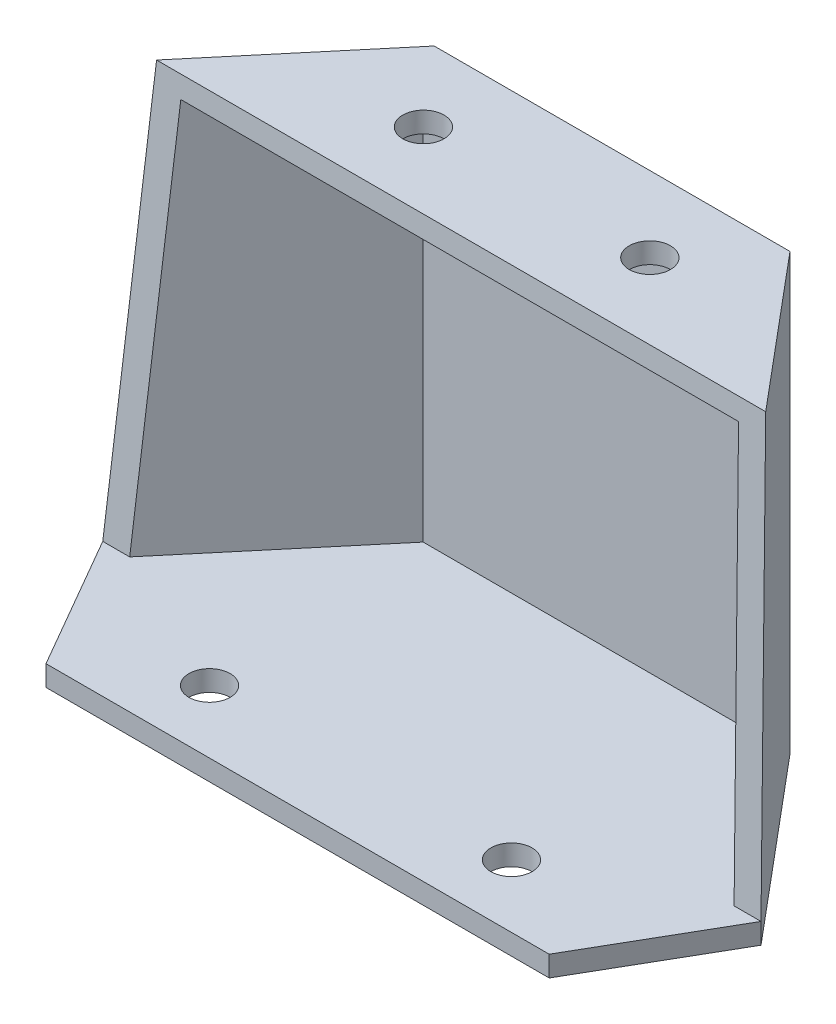
ISO-10303-21;
HEADER;
FILE_DESCRIPTION(('STEP AP214'),'2;1');
FILE_NAME('part.step','',(''),(''),'','','');
FILE_SCHEMA(('AUTOMOTIVE_DESIGN { 1 0 10303 214 1 1 1 1 }'));
ENDSEC;
DATA;
#1=APPLICATION_CONTEXT('core data for automotive mechanical design processes');
#2=APPLICATION_PROTOCOL_DEFINITION('international standard','automotive_design',2000,#1);
#3=PRODUCT_CONTEXT('',#1,'mechanical');
#4=PRODUCT('Part','Part','',(#3));
#5=PRODUCT_RELATED_PRODUCT_CATEGORY('part','',(#4));
#6=PRODUCT_DEFINITION_FORMATION('','',#4);
#7=PRODUCT_DEFINITION_CONTEXT('part definition',#1,'design');
#8=PRODUCT_DEFINITION('design','',#6,#7);
#9=PRODUCT_DEFINITION_SHAPE('','',#8);
#10=(LENGTH_UNIT() NAMED_UNIT(*) SI_UNIT(.MILLI.,.METRE.));
#11=(NAMED_UNIT(*) PLANE_ANGLE_UNIT() SI_UNIT($,.RADIAN.));
#12=(NAMED_UNIT(*) SI_UNIT($,.STERADIAN.) SOLID_ANGLE_UNIT());
#13=UNCERTAINTY_MEASURE_WITH_UNIT(LENGTH_MEASURE(1.E-05),#10,'distance_accuracy_value','');
#14=(GEOMETRIC_REPRESENTATION_CONTEXT(3) GLOBAL_UNCERTAINTY_ASSIGNED_CONTEXT((#13)) GLOBAL_UNIT_ASSIGNED_CONTEXT((#10,
#11,#12)) REPRESENTATION_CONTEXT('',''));
#15=CARTESIAN_POINT('',(0.,0.,0.));
#16=DIRECTION('',(0.,0.,1.));
#17=DIRECTION('',(1.,0.,0.));
#18=AXIS2_PLACEMENT_3D('',#15,#16,#17);
#19=CARTESIAN_POINT('',(-122.,211.,0.));
#20=DIRECTION('',(0.866025403784438,0.,-0.500000000000001));
#21=DIRECTION('',(-0.500000000000001,0.,-0.866025403784438));
#22=AXIS2_PLACEMENT_3D('',#19,#20,#21);
#23=PLANE('',#22);
#24=DIRECTION('',(0.,-1.,0.));
#25=VECTOR('',#24,1.);
#26=CARTESIAN_POINT('',(-122.,211.,0.));
#27=LINE('',#26,#25);
#28=CARTESIAN_POINT('',(-122.,10.,0.));
#29=VERTEX_POINT('',#28);
#30=CARTESIAN_POINT('',(-122.,0.,0.));
#31=VERTEX_POINT('',#30);
#32=EDGE_CURVE('E152',#29,#31,#27,.T.);
#33=ORIENTED_EDGE('',*,*,#32,.F.);
#34=DIRECTION('',(-0.500000000000001,0.,-0.866025403784438));
#35=VECTOR('',#34,1.);
#36=CARTESIAN_POINT('',(-122.,10.,0.));
#37=LINE('',#36,#35);
#38=CARTESIAN_POINT('',(-159.592352403094,10.,-65.1118643381918));
#39=VERTEX_POINT('',#38);
#40=EDGE_CURVE('E129',#29,#39,#37,.T.);
#41=ORIENTED_EDGE('',*,*,#40,.T.);
#42=DIRECTION('',(0.,-1.,0.));
#43=VECTOR('',#42,1.);
#44=CARTESIAN_POINT('',(-159.592352403094,211.,-65.1118643381918));
#45=LINE('',#44,#43);
#46=CARTESIAN_POINT('',(-159.592352403094,0.,-65.1118643381918));
#47=VERTEX_POINT('',#46);
#48=EDGE_CURVE('E192',#39,#47,#45,.T.);
#49=ORIENTED_EDGE('',*,*,#48,.T.);
#50=DIRECTION('',(0.500000000000001,0.,0.866025403784438));
#51=VECTOR('',#50,1.);
#52=CARTESIAN_POINT('',(-122.,0.,0.));
#53=LINE('',#52,#51);
#54=EDGE_CURVE('E194',#47,#31,#53,.T.);
#55=ORIENTED_EDGE('',*,*,#54,.T.);
#56=EDGE_LOOP('',(#33,#41,#49,#55));
#57=FACE_BOUND('',#56,.T.);
#58=ADVANCED_FACE('F36',(#57),#23,.F.);
#59=CARTESIAN_POINT('',(122.,211.,0.));
#60=DIRECTION('',(0.,0.,-1.));
#61=DIRECTION('',(-1.,0.,0.));
#62=AXIS2_PLACEMENT_3D('',#59,#60,#61);
#63=PLANE('',#62);
#64=DIRECTION('',(0.,-1.,0.));
#65=VECTOR('',#64,1.);
#66=CARTESIAN_POINT('',(122.,211.,0.));
#67=LINE('',#66,#65);
#68=CARTESIAN_POINT('',(122.,10.,0.));
#69=VERTEX_POINT('',#68);
#70=CARTESIAN_POINT('',(122.,0.,0.));
#71=VERTEX_POINT('',#70);
#72=EDGE_CURVE('E149',#69,#71,#67,.T.);
#73=ORIENTED_EDGE('',*,*,#72,.F.);
#74=DIRECTION('',(1.,0.,0.));
#75=VECTOR('',#74,1.);
#76=CARTESIAN_POINT('',(-159.592352403094,10.,0.));
#77=LINE('',#76,#75);
#78=EDGE_CURVE('E125',#29,#69,#77,.T.);
#79=ORIENTED_EDGE('',*,*,#78,.F.);
#80=ORIENTED_EDGE('',*,*,#32,.T.);
#81=DIRECTION('',(1.,0.,0.));
#82=VECTOR('',#81,1.);
#83=CARTESIAN_POINT('',(122.,0.,0.));
#84=LINE('',#83,#82);
#85=EDGE_CURVE('E216',#31,#71,#84,.T.);
#86=ORIENTED_EDGE('',*,*,#85,.T.);
#87=EDGE_LOOP('',(#73,#79,#80,#86));
#88=FACE_BOUND('',#87,.T.);
#89=ADVANCED_FACE('F277',(#88),#63,.F.);
#90=CARTESIAN_POINT('',(122.,211.,0.));
#91=DIRECTION('',(-0.866025403784438,0.,-0.500000000000001));
#92=DIRECTION('',(-0.500000000000001,0.,0.866025403784438));
#93=AXIS2_PLACEMENT_3D('',#90,#91,#92);
#94=PLANE('',#93);
#95=DIRECTION('',(0.,-1.,0.));
#96=VECTOR('',#95,1.);
#97=CARTESIAN_POINT('',(159.592352403094,211.,-65.1118643381918));
#98=LINE('',#97,#96);
#99=CARTESIAN_POINT('',(159.592352403094,10.,-65.1118643381918));
#100=VERTEX_POINT('',#99);
#101=CARTESIAN_POINT('',(159.592352403094,0.,-65.1118643381918));
#102=VERTEX_POINT('',#101);
#103=EDGE_CURVE('E139',#100,#102,#98,.T.);
#104=ORIENTED_EDGE('',*,*,#103,.F.);
#105=DIRECTION('',(-0.500000000000001,0.,0.866025403784438));
#106=VECTOR('',#105,1.);
#107=CARTESIAN_POINT('',(122.,10.,0.));
#108=LINE('',#107,#106);
#109=EDGE_CURVE('E121',#100,#69,#108,.T.);
#110=ORIENTED_EDGE('',*,*,#109,.T.);
#111=ORIENTED_EDGE('',*,*,#72,.T.);
#112=DIRECTION('',(0.500000000000001,0.,-0.866025403784438));
#113=VECTOR('',#112,1.);
#114=CARTESIAN_POINT('',(122.,0.,0.));
#115=LINE('',#114,#113);
#116=EDGE_CURVE('E147',#71,#102,#115,.T.);
#117=ORIENTED_EDGE('',*,*,#116,.T.);
#118=EDGE_LOOP('',(#104,#110,#111,#117));
#119=FACE_BOUND('',#118,.T.);
#120=ADVANCED_FACE('F145',(#119),#94,.F.);
#121=CARTESIAN_POINT('',(159.592352403094,211.,-65.1118643381918));
#122=DIRECTION('',(-0.766044443118977,0.,0.642787609686541));
#123=DIRECTION('',(0.642787609686541,0.,0.766044443118977));
#124=AXIS2_PLACEMENT_3D('',#121,#122,#123);
#125=PLANE('',#124);
#126=DIRECTION('',(-0.64278760968654,0.,-0.766044443118977));
#127=VECTOR('',#126,1.);
#128=CARTESIAN_POINT('',(159.592352403094,211.,-65.1118643381918));
#129=LINE('',#128,#127);
#130=CARTESIAN_POINT('',(147.687093002177,211.,-79.3));
#131=VERTEX_POINT('',#130);
#132=CARTESIAN_POINT('',(86.265,211.,-152.5));
#133=VERTEX_POINT('',#132);
#134=EDGE_CURVE('E142',#131,#133,#129,.T.);
#135=ORIENTED_EDGE('',*,*,#134,.F.);
#136=DIRECTION('',(0.058980279511746,-0.995781425892182,0.0702899600003337));
#137=VECTOR('',#136,1.);
#138=CARTESIAN_POINT('',(147.787327569917,209.307710278525,-79.1805450937942));
#139=LINE('',#138,#137);
#140=EDGE_CURVE('E53',#131,#100,#139,.T.);
#141=ORIENTED_EDGE('',*,*,#140,.T.);
#142=ORIENTED_EDGE('',*,*,#103,.T.);
#143=DIRECTION('',(-0.64278760968654,0.,-0.766044443118977));
#144=VECTOR('',#143,1.);
#145=CARTESIAN_POINT('',(159.592352403094,0.,-65.1118643381918));
#146=LINE('',#145,#144);
#147=CARTESIAN_POINT('',(86.265,0.,-152.5));
#148=VERTEX_POINT('',#147);
#149=EDGE_CURVE('E213',#102,#148,#146,.T.);
#150=ORIENTED_EDGE('',*,*,#149,.T.);
#151=DIRECTION('',(0.,-1.,0.));
#152=VECTOR('',#151,1.);
#153=CARTESIAN_POINT('',(86.265,211.,-152.5));
#154=LINE('',#153,#152);
#155=EDGE_CURVE('E150',#133,#148,#154,.T.);
#156=ORIENTED_EDGE('',*,*,#155,.F.);
#157=EDGE_LOOP('',(#135,#141,#142,#150,#156));
#158=FACE_BOUND('',#157,.T.);
#159=ADVANCED_FACE('F138',(#158),#125,.F.);
#160=CARTESIAN_POINT('',(-86.265,211.,-152.5));
#161=DIRECTION('',(0.,0.,1.));
#162=DIRECTION('',(1.,0.,0.));
#163=AXIS2_PLACEMENT_3D('',#160,#161,#162);
#164=PLANE('',#163);
#165=DIRECTION('',(-1.,0.,0.));
#166=VECTOR('',#165,1.);
#167=CARTESIAN_POINT('',(-86.265,0.,-152.5));
#168=LINE('',#167,#166);
#169=CARTESIAN_POINT('',(-86.265,0.,-152.5));
#170=VERTEX_POINT('',#169);
#171=EDGE_CURVE('E211',#148,#170,#168,.T.);
#172=ORIENTED_EDGE('',*,*,#171,.T.);
#173=DIRECTION('',(0.,-1.,0.));
#174=VECTOR('',#173,1.);
#175=CARTESIAN_POINT('',(-86.265,211.,-152.5));
#176=LINE('',#175,#174);
#177=CARTESIAN_POINT('',(-86.265,211.,-152.5));
#178=VERTEX_POINT('',#177);
#179=EDGE_CURVE('E155',#178,#170,#176,.T.);
#180=ORIENTED_EDGE('',*,*,#179,.F.);
#181=DIRECTION('',(-1.,0.,0.));
#182=VECTOR('',#181,1.);
#183=CARTESIAN_POINT('',(-86.265,211.,-152.5));
#184=LINE('',#183,#182);
#185=EDGE_CURVE('E207',#133,#178,#184,.T.);
#186=ORIENTED_EDGE('',*,*,#185,.F.);
#187=ORIENTED_EDGE('',*,*,#155,.T.);
#188=EDGE_LOOP('',(#172,#180,#186,#187));
#189=FACE_BOUND('',#188,.T.);
#190=ADVANCED_FACE('F317',(#189),#164,.F.);
#191=CARTESIAN_POINT('',(-159.592352403094,211.,-65.1118643381918));
#192=DIRECTION('',(0.766044443118977,0.,0.642787609686541));
#193=DIRECTION('',(0.642787609686541,0.,-0.766044443118977));
#194=AXIS2_PLACEMENT_3D('',#191,#192,#193);
#195=PLANE('',#194);
#196=ORIENTED_EDGE('',*,*,#48,.F.);
#197=DIRECTION('',(0.058980279511746,0.995781425892182,-0.0702899600003337));
#198=VECTOR('',#197,1.);
#199=CARTESIAN_POINT('',(-147.787327569917,209.307710278525,-79.1805450937942));
#200=LINE('',#199,#198);
#201=CARTESIAN_POINT('',(-147.687093002177,211.,-79.3));
#202=VERTEX_POINT('',#201);
#203=EDGE_CURVE('E143',#39,#202,#200,.T.);
#204=ORIENTED_EDGE('',*,*,#203,.T.);
#205=DIRECTION('',(-0.64278760968654,0.,0.766044443118977));
#206=VECTOR('',#205,1.);
#207=CARTESIAN_POINT('',(-159.592352403094,211.,-65.1118643381918));
#208=LINE('',#207,#206);
#209=EDGE_CURVE('E205',#178,#202,#208,.T.);
#210=ORIENTED_EDGE('',*,*,#209,.F.);
#211=ORIENTED_EDGE('',*,*,#179,.T.);
#212=DIRECTION('',(-0.64278760968654,0.,0.766044443118977));
#213=VECTOR('',#212,1.);
#214=CARTESIAN_POINT('',(-159.592352403094,0.,-65.1118643381918));
#215=LINE('',#214,#213);
#216=EDGE_CURVE('E203',#170,#47,#215,.T.);
#217=ORIENTED_EDGE('',*,*,#216,.T.);
#218=EDGE_LOOP('',(#196,#204,#210,#211,#217));
#219=FACE_BOUND('',#218,.T.);
#220=ADVANCED_FACE('F198',(#219),#195,.F.);
#221=CARTESIAN_POINT('',(0.,211.,0.));
#222=DIRECTION('',(0.,-1.,0.));
#223=DIRECTION('',(0.,0.,-1.));
#224=AXIS2_PLACEMENT_3D('',#221,#222,#223);
#225=PLANE('',#224);
#226=CARTESIAN_POINT('',(-54.9,211.,-115.9));
#227=DIRECTION('',(0.,1.,0.));
#228=DIRECTION('',(0.,0.,1.));
#229=AXIS2_PLACEMENT_3D('',#226,#227,#228);
#230=CIRCLE('',#229,10.);
#231=CARTESIAN_POINT('',(-54.9,211.,-105.9));
#232=VERTEX_POINT('',#231);
#233=EDGE_CURVE('E227',#232,#232,#230,.T.);
#234=ORIENTED_EDGE('',*,*,#233,.F.);
#235=EDGE_LOOP('',(#234));
#236=FACE_BOUND('',#235,.T.);
#237=CARTESIAN_POINT('',(54.9,211.,-115.9));
#238=DIRECTION('',(0.,1.,0.));
#239=DIRECTION('',(0.,0.,1.));
#240=AXIS2_PLACEMENT_3D('',#237,#238,#239);
#241=CIRCLE('',#240,9.99999999999999);
#242=CARTESIAN_POINT('',(54.9,211.,-105.9));
#243=VERTEX_POINT('',#242);
#244=EDGE_CURVE('E230',#243,#243,#241,.T.);
#245=ORIENTED_EDGE('',*,*,#244,.F.);
#246=EDGE_LOOP('',(#245));
#247=FACE_BOUND('',#246,.T.);
#248=ORIENTED_EDGE('',*,*,#209,.T.);
#249=DIRECTION('',(1.,0.,0.));
#250=VECTOR('',#249,1.);
#251=CARTESIAN_POINT('',(-159.592352403094,211.,-79.3));
#252=LINE('',#251,#250);
#253=EDGE_CURVE('E187',#202,#131,#252,.T.);
#254=ORIENTED_EDGE('',*,*,#253,.T.);
#255=ORIENTED_EDGE('',*,*,#134,.T.);
#256=ORIENTED_EDGE('',*,*,#185,.T.);
#257=EDGE_LOOP('',(#248,#254,#255,#256));
#258=FACE_BOUND('',#257,.T.);
#259=ADVANCED_FACE('F305',(#236,#247,#258),#225,.F.);
#260=CARTESIAN_POINT('',(0.,0.,0.));
#261=DIRECTION('',(0.,-1.,0.));
#262=DIRECTION('',(0.,0.,-1.));
#263=AXIS2_PLACEMENT_3D('',#260,#261,#262);
#264=PLANE('',#263);
#265=CARTESIAN_POINT('',(-73.2,0.,-30.5));
#266=DIRECTION('',(0.,-1.,0.));
#267=DIRECTION('',(0.,0.,-1.));
#268=AXIS2_PLACEMENT_3D('',#265,#266,#267);
#269=CIRCLE('',#268,9.99999999999999);
#270=CARTESIAN_POINT('',(-73.2,0.,-40.5));
#271=VERTEX_POINT('',#270);
#272=EDGE_CURVE('E248',#271,#271,#269,.F.);
#273=ORIENTED_EDGE('',*,*,#272,.T.);
#274=EDGE_LOOP('',(#273));
#275=FACE_BOUND('',#274,.T.);
#276=CARTESIAN_POINT('',(73.2,0.,-30.5));
#277=DIRECTION('',(0.,-1.,0.));
#278=DIRECTION('',(0.,0.,-1.));
#279=AXIS2_PLACEMENT_3D('',#276,#277,#278);
#280=CIRCLE('',#279,10.);
#281=CARTESIAN_POINT('',(73.2,0.,-40.5));
#282=VERTEX_POINT('',#281);
#283=EDGE_CURVE('E242',#282,#282,#280,.F.);
#284=ORIENTED_EDGE('',*,*,#283,.T.);
#285=EDGE_LOOP('',(#284));
#286=FACE_BOUND('',#285,.T.);
#287=ORIENTED_EDGE('',*,*,#54,.F.);
#288=ORIENTED_EDGE('',*,*,#216,.F.);
#289=ORIENTED_EDGE('',*,*,#171,.F.);
#290=ORIENTED_EDGE('',*,*,#149,.F.);
#291=ORIENTED_EDGE('',*,*,#116,.F.);
#292=ORIENTED_EDGE('',*,*,#85,.F.);
#293=EDGE_LOOP('',(#287,#288,#289,#290,#291,#292));
#294=FACE_BOUND('',#293,.T.);
#295=ADVANCED_FACE('F308',(#275,#286,#294),#264,.T.);
#296=CARTESIAN_POINT('',(-159.592352403094,211.,-79.3));
#297=DIRECTION('',(0.,-0.0704125378053743,-0.997517956991154));
#298=DIRECTION('',(0.,0.997517956991155,-0.0704125378053743));
#299=AXIS2_PLACEMENT_3D('',#296,#297,#298);
#300=PLANE('',#299);
#301=ORIENTED_EDGE('',*,*,#253,.F.);
#302=ORIENTED_EDGE('',*,*,#203,.F.);
#303=DIRECTION('',(1.,0.,0.));
#304=VECTOR('',#303,1.);
#305=CARTESIAN_POINT('',(-159.592352403094,10.,-65.1118643381918));
#306=LINE('',#305,#304);
#307=CARTESIAN_POINT('',(-146.538279509771,10.,-65.1118643381918));
#308=VERTEX_POINT('',#307);
#309=EDGE_CURVE('E134',#39,#308,#306,.T.);
#310=ORIENTED_EDGE('',*,*,#309,.T.);
#311=DIRECTION('',(0.058980279511746,0.995781425892182,-0.0702899600003337));
#312=VECTOR('',#311,1.);
#313=CARTESIAN_POINT('',(-134.778665532355,208.541025429372,-79.1264265432985));
#314=LINE('',#313,#312);
#315=CARTESIAN_POINT('',(-135.225321571586,201.,-78.5941226038901));
#316=VERTEX_POINT('',#315);
#317=EDGE_CURVE('E60',#308,#316,#314,.T.);
#318=ORIENTED_EDGE('',*,*,#317,.T.);
#319=DIRECTION('',(1.,0.,0.));
#320=VECTOR('',#319,1.);
#321=CARTESIAN_POINT('',(0.,201.,-78.5941226038901));
#322=LINE('',#321,#320);
#323=CARTESIAN_POINT('',(135.225321571586,201.,-78.5941226038901));
#324=VERTEX_POINT('',#323);
#325=EDGE_CURVE('E225',#316,#324,#322,.T.);
#326=ORIENTED_EDGE('',*,*,#325,.T.);
#327=DIRECTION('',(0.058980279511746,-0.995781425892182,0.0702899600003337));
#328=VECTOR('',#327,1.);
#329=CARTESIAN_POINT('',(134.778665532355,208.541025429372,-79.1264265432985));
#330=LINE('',#329,#328);
#331=CARTESIAN_POINT('',(146.538279509771,10.,-65.1118643381918));
#332=VERTEX_POINT('',#331);
#333=EDGE_CURVE('E133',#324,#332,#330,.T.);
#334=ORIENTED_EDGE('',*,*,#333,.T.);
#335=EDGE_CURVE('E122',#332,#100,#306,.T.);
#336=ORIENTED_EDGE('',*,*,#335,.T.);
#337=ORIENTED_EDGE('',*,*,#140,.F.);
#338=EDGE_LOOP('',(#301,#302,#310,#318,#326,#334,#336,#337));
#339=FACE_BOUND('',#338,.T.);
#340=ADVANCED_FACE('F131',(#339),#300,.F.);
#341=CARTESIAN_POINT('',(151.931907971904,211.,-58.6839882413264));
#342=DIRECTION('',(-0.766044443118977,0.,0.642787609686541));
#343=DIRECTION('',(0.642787609686541,0.,0.766044443118977));
#344=AXIS2_PLACEMENT_3D('',#341,#342,#343);
#345=PLANE('',#344);
#346=ORIENTED_EDGE('',*,*,#333,.F.);
#347=DIRECTION('',(-0.642787609686541,0.,-0.766044443118977));
#348=VECTOR('',#347,1.);
#349=CARTESIAN_POINT('',(118.05352675921,201.,-99.0586707628305));
#350=LINE('',#349,#348);
#351=CARTESIAN_POINT('',(81.60192341845,201.,-142.5));
#352=VERTEX_POINT('',#351);
#353=EDGE_CURVE('E161',#324,#352,#350,.T.);
#354=ORIENTED_EDGE('',*,*,#353,.T.);
#355=DIRECTION('',(0.,-1.,0.));
#356=VECTOR('',#355,1.);
#357=CARTESIAN_POINT('',(81.60192341845,211.,-142.5));
#358=LINE('',#357,#356);
#359=CARTESIAN_POINT('',(81.60192341845,10.,-142.5));
#360=VERTEX_POINT('',#359);
#361=EDGE_CURVE('E169',#352,#360,#358,.T.);
#362=ORIENTED_EDGE('',*,*,#361,.T.);
#363=DIRECTION('',(-0.642787609686541,0.,-0.766044443118977));
#364=VECTOR('',#363,1.);
#365=CARTESIAN_POINT('',(118.05352675921,10.,-99.0586707628305));
#366=LINE('',#365,#364);
#367=EDGE_CURVE('E40',#332,#360,#366,.T.);
#368=ORIENTED_EDGE('',*,*,#367,.F.);
#369=EDGE_LOOP('',(#346,#354,#362,#368));
#370=FACE_BOUND('',#369,.T.);
#371=ADVANCED_FACE('F175',(#370),#345,.T.);
#372=CARTESIAN_POINT('',(-86.265,211.,-142.5));
#373=DIRECTION('',(0.,0.,1.));
#374=DIRECTION('',(1.,0.,0.));
#375=AXIS2_PLACEMENT_3D('',#372,#373,#374);
#376=PLANE('',#375);
#377=DIRECTION('',(-1.,0.,0.));
#378=VECTOR('',#377,1.);
#379=CARTESIAN_POINT('',(0.,10.,-142.5));
#380=LINE('',#379,#378);
#381=CARTESIAN_POINT('',(-81.60192341845,10.,-142.5));
#382=VERTEX_POINT('',#381);
#383=EDGE_CURVE('E171',#360,#382,#380,.T.);
#384=ORIENTED_EDGE('',*,*,#383,.F.);
#385=ORIENTED_EDGE('',*,*,#361,.F.);
#386=DIRECTION('',(-1.,0.,0.));
#387=VECTOR('',#386,1.);
#388=CARTESIAN_POINT('',(0.,201.,-142.5));
#389=LINE('',#388,#387);
#390=CARTESIAN_POINT('',(-81.60192341845,201.,-142.5));
#391=VERTEX_POINT('',#390);
#392=EDGE_CURVE('E45',#352,#391,#389,.T.);
#393=ORIENTED_EDGE('',*,*,#392,.T.);
#394=DIRECTION('',(0.,-1.,0.));
#395=VECTOR('',#394,1.);
#396=CARTESIAN_POINT('',(-81.60192341845,211.,-142.5));
#397=LINE('',#396,#395);
#398=EDGE_CURVE('E163',#391,#382,#397,.T.);
#399=ORIENTED_EDGE('',*,*,#398,.T.);
#400=EDGE_LOOP('',(#384,#385,#393,#399));
#401=FACE_BOUND('',#400,.T.);
#402=ADVANCED_FACE('F179',(#401),#376,.T.);
#403=CARTESIAN_POINT('',(-151.931907971904,211.,-58.6839882413264));
#404=DIRECTION('',(0.766044443118977,0.,0.642787609686541));
#405=DIRECTION('',(0.642787609686541,0.,-0.766044443118977));
#406=AXIS2_PLACEMENT_3D('',#403,#404,#405);
#407=PLANE('',#406);
#408=ORIENTED_EDGE('',*,*,#317,.F.);
#409=DIRECTION('',(-0.642787609686541,0.,0.766044443118977));
#410=VECTOR('',#409,1.);
#411=CARTESIAN_POINT('',(-118.05352675921,10.,-99.0586707628305));
#412=LINE('',#411,#410);
#413=EDGE_CURVE('E166',#382,#308,#412,.T.);
#414=ORIENTED_EDGE('',*,*,#413,.F.);
#415=ORIENTED_EDGE('',*,*,#398,.F.);
#416=DIRECTION('',(-0.642787609686541,0.,0.766044443118977));
#417=VECTOR('',#416,1.);
#418=CARTESIAN_POINT('',(-118.05352675921,201.,-99.0586707628305));
#419=LINE('',#418,#417);
#420=EDGE_CURVE('E11',#391,#316,#419,.T.);
#421=ORIENTED_EDGE('',*,*,#420,.T.);
#422=EDGE_LOOP('',(#408,#414,#415,#421));
#423=FACE_BOUND('',#422,.T.);
#424=ADVANCED_FACE('F184',(#423),#407,.T.);
#425=CARTESIAN_POINT('',(0.,201.,0.));
#426=DIRECTION('',(0.,-1.,0.));
#427=DIRECTION('',(0.,0.,-1.));
#428=AXIS2_PLACEMENT_3D('',#425,#426,#427);
#429=PLANE('',#428);
#430=CARTESIAN_POINT('',(-54.9,201.,-115.9));
#431=DIRECTION('',(0.,-1.,0.));
#432=DIRECTION('',(0.,0.,-1.));
#433=AXIS2_PLACEMENT_3D('',#430,#431,#432);
#434=CIRCLE('',#433,10.);
#435=CARTESIAN_POINT('',(-54.9,201.,-125.9));
#436=VERTEX_POINT('',#435);
#437=EDGE_CURVE('E233',#436,#436,#434,.F.);
#438=ORIENTED_EDGE('',*,*,#437,.T.);
#439=EDGE_LOOP('',(#438));
#440=FACE_BOUND('',#439,.T.);
#441=CARTESIAN_POINT('',(54.9,201.,-115.9));
#442=DIRECTION('',(0.,-1.,0.));
#443=DIRECTION('',(0.,0.,-1.));
#444=AXIS2_PLACEMENT_3D('',#441,#442,#443);
#445=CIRCLE('',#444,9.99999999999999);
#446=CARTESIAN_POINT('',(54.9,201.,-125.9));
#447=VERTEX_POINT('',#446);
#448=EDGE_CURVE('E234',#447,#447,#445,.F.);
#449=ORIENTED_EDGE('',*,*,#448,.T.);
#450=EDGE_LOOP('',(#449));
#451=FACE_BOUND('',#450,.T.);
#452=ORIENTED_EDGE('',*,*,#325,.F.);
#453=ORIENTED_EDGE('',*,*,#420,.F.);
#454=ORIENTED_EDGE('',*,*,#392,.F.);
#455=ORIENTED_EDGE('',*,*,#353,.F.);
#456=EDGE_LOOP('',(#452,#453,#454,#455));
#457=FACE_BOUND('',#456,.T.);
#458=ADVANCED_FACE('F259',(#440,#451,#457),#429,.T.);
#459=CARTESIAN_POINT('',(0.,10.,0.));
#460=DIRECTION('',(0.,-1.,0.));
#461=DIRECTION('',(0.,0.,-1.));
#462=AXIS2_PLACEMENT_3D('',#459,#460,#461);
#463=PLANE('',#462);
#464=CARTESIAN_POINT('',(-73.2,10.,-30.5));
#465=DIRECTION('',(0.,1.,0.));
#466=DIRECTION('',(0.,0.,1.));
#467=AXIS2_PLACEMENT_3D('',#464,#465,#466);
#468=CIRCLE('',#467,9.99999999999999);
#469=CARTESIAN_POINT('',(-73.2,10.,-20.5));
#470=VERTEX_POINT('',#469);
#471=EDGE_CURVE('E237',#470,#470,#468,.T.);
#472=ORIENTED_EDGE('',*,*,#471,.F.);
#473=EDGE_LOOP('',(#472));
#474=FACE_BOUND('',#473,.T.);
#475=CARTESIAN_POINT('',(73.2,10.,-30.5));
#476=DIRECTION('',(0.,1.,0.));
#477=DIRECTION('',(0.,0.,1.));
#478=AXIS2_PLACEMENT_3D('',#475,#476,#477);
#479=CIRCLE('',#478,10.);
#480=CARTESIAN_POINT('',(73.2,10.,-20.5));
#481=VERTEX_POINT('',#480);
#482=EDGE_CURVE('E245',#481,#481,#479,.T.);
#483=ORIENTED_EDGE('',*,*,#482,.F.);
#484=EDGE_LOOP('',(#483));
#485=FACE_BOUND('',#484,.T.);
#486=ORIENTED_EDGE('',*,*,#335,.F.);
#487=ORIENTED_EDGE('',*,*,#367,.T.);
#488=ORIENTED_EDGE('',*,*,#383,.T.);
#489=ORIENTED_EDGE('',*,*,#413,.T.);
#490=ORIENTED_EDGE('',*,*,#309,.F.);
#491=ORIENTED_EDGE('',*,*,#40,.F.);
#492=ORIENTED_EDGE('',*,*,#78,.T.);
#493=ORIENTED_EDGE('',*,*,#109,.F.);
#494=EDGE_LOOP('',(#486,#487,#488,#489,#490,#491,#492,#493));
#495=FACE_BOUND('',#494,.T.);
#496=ADVANCED_FACE('F38',(#474,#485,#495),#463,.F.);
#497=CARTESIAN_POINT('',(54.9,-0.001000000000001,-115.9));
#498=DIRECTION('',(0.,1.,0.));
#499=DIRECTION('',(0.,0.,1.));
#500=AXIS2_PLACEMENT_3D('',#497,#498,#499);
#501=CYLINDRICAL_SURFACE('',#500,9.99999999999999);
#502=ORIENTED_EDGE('',*,*,#448,.F.);
#503=EDGE_LOOP('',(#502));
#504=FACE_BOUND('',#503,.T.);
#505=ORIENTED_EDGE('',*,*,#244,.T.);
#506=EDGE_LOOP('',(#505));
#507=FACE_BOUND('',#506,.T.);
#508=ADVANCED_FACE('F258',(#504,#507),#501,.F.);
#509=CARTESIAN_POINT('',(-54.9,-0.001000000000001,-115.9));
#510=DIRECTION('',(0.,1.,0.));
#511=DIRECTION('',(0.,0.,1.));
#512=AXIS2_PLACEMENT_3D('',#509,#510,#511);
#513=CYLINDRICAL_SURFACE('',#512,10.);
#514=ORIENTED_EDGE('',*,*,#437,.F.);
#515=EDGE_LOOP('',(#514));
#516=FACE_BOUND('',#515,.T.);
#517=ORIENTED_EDGE('',*,*,#233,.T.);
#518=EDGE_LOOP('',(#517));
#519=FACE_BOUND('',#518,.T.);
#520=ADVANCED_FACE('F264',(#516,#519),#513,.F.);
#521=CARTESIAN_POINT('',(73.2,-0.000999999999999265,-30.5));
#522=DIRECTION('',(0.,1.,0.));
#523=DIRECTION('',(0.,0.,1.));
#524=AXIS2_PLACEMENT_3D('',#521,#522,#523);
#525=CYLINDRICAL_SURFACE('',#524,10.);
#526=ORIENTED_EDGE('',*,*,#283,.F.);
#527=EDGE_LOOP('',(#526));
#528=FACE_BOUND('',#527,.T.);
#529=ORIENTED_EDGE('',*,*,#482,.T.);
#530=EDGE_LOOP('',(#529));
#531=FACE_BOUND('',#530,.T.);
#532=ADVANCED_FACE('F262',(#528,#531),#525,.F.);
#533=CARTESIAN_POINT('',(-73.2,-0.000999999999999265,-30.5));
#534=DIRECTION('',(0.,1.,0.));
#535=DIRECTION('',(0.,0.,1.));
#536=AXIS2_PLACEMENT_3D('',#533,#534,#535);
#537=CYLINDRICAL_SURFACE('',#536,9.99999999999999);
#538=ORIENTED_EDGE('',*,*,#272,.F.);
#539=EDGE_LOOP('',(#538));
#540=FACE_BOUND('',#539,.T.);
#541=ORIENTED_EDGE('',*,*,#471,.T.);
#542=EDGE_LOOP('',(#541));
#543=FACE_BOUND('',#542,.T.);
#544=ADVANCED_FACE('F254',(#540,#543),#537,.F.);
#545=CLOSED_SHELL('',(#58,#89,#120,#159,#190,#220,#259,#295,#340,#371,#402,#424,#458,#496,#508,
#520,#532,#544));
#546=MANIFOLD_SOLID_BREP('B2',#545);
#547=ADVANCED_BREP_SHAPE_REPRESENTATION('',(#18,#546),#14);
#548=SHAPE_DEFINITION_REPRESENTATION(#9,#547);
ENDSEC;
END-ISO-10303-21;
